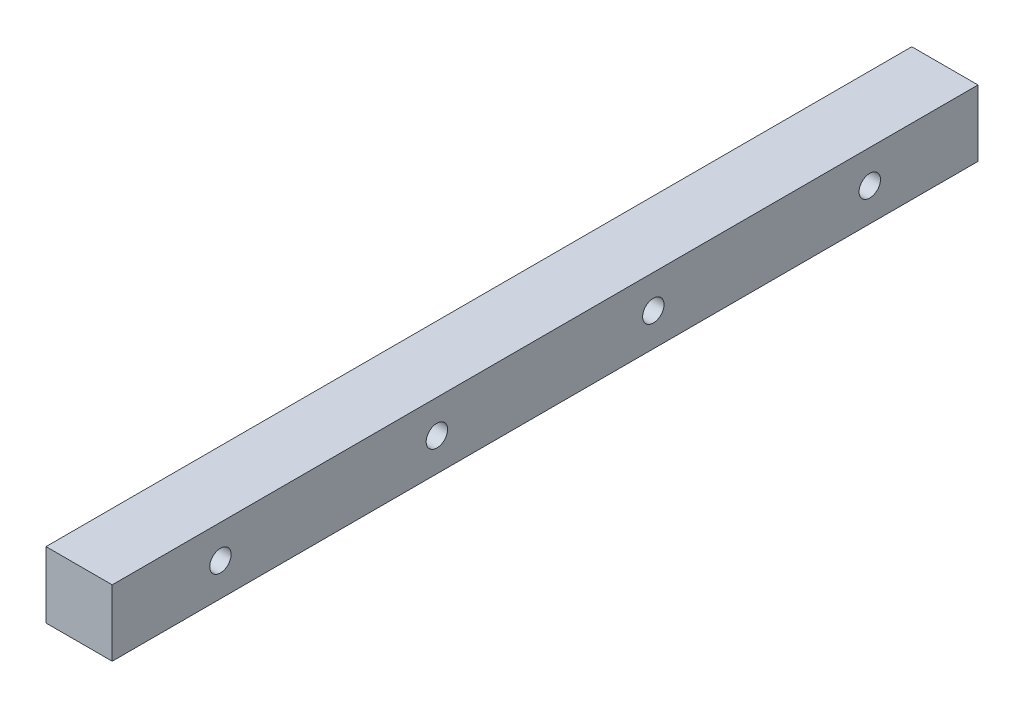
ISO-10303-21;
HEADER;
FILE_DESCRIPTION(('STEP AP214'),'2;1');
FILE_NAME('part.step','',(''),(''),'','','');
FILE_SCHEMA(('AUTOMOTIVE_DESIGN { 1 0 10303 214 1 1 1 1 }'));
ENDSEC;
DATA;
#1=APPLICATION_CONTEXT('core data for automotive mechanical design processes');
#2=APPLICATION_PROTOCOL_DEFINITION('international standard','automotive_design',2000,#1);
#3=PRODUCT_CONTEXT('',#1,'mechanical');
#4=PRODUCT('Part','Part','',(#3));
#5=PRODUCT_RELATED_PRODUCT_CATEGORY('part','',(#4));
#6=PRODUCT_DEFINITION_FORMATION('','',#4);
#7=PRODUCT_DEFINITION_CONTEXT('part definition',#1,'design');
#8=PRODUCT_DEFINITION('design','',#6,#7);
#9=PRODUCT_DEFINITION_SHAPE('','',#8);
#10=(LENGTH_UNIT() NAMED_UNIT(*) SI_UNIT(.MILLI.,.METRE.));
#11=(NAMED_UNIT(*) PLANE_ANGLE_UNIT() SI_UNIT($,.RADIAN.));
#12=(NAMED_UNIT(*) SI_UNIT($,.STERADIAN.) SOLID_ANGLE_UNIT());
#13=UNCERTAINTY_MEASURE_WITH_UNIT(LENGTH_MEASURE(1.E-05),#10,'distance_accuracy_value','');
#14=(GEOMETRIC_REPRESENTATION_CONTEXT(3) GLOBAL_UNCERTAINTY_ASSIGNED_CONTEXT((#13)) GLOBAL_UNIT_ASSIGNED_CONTEXT((#10,
#11,#12)) REPRESENTATION_CONTEXT('',''));
#15=CARTESIAN_POINT('',(0.,0.,0.));
#16=DIRECTION('',(0.,0.,1.));
#17=DIRECTION('',(1.,0.,0.));
#18=AXIS2_PLACEMENT_3D('',#15,#16,#17);
#19=CARTESIAN_POINT('',(-6.5,6.5,85.));
#20=DIRECTION('',(1.,0.,0.));
#21=DIRECTION('',(0.,0.,-1.));
#22=AXIS2_PLACEMENT_3D('',#19,#20,#21);
#23=PLANE('',#22);
#24=CARTESIAN_POINT('',(-6.5,0.,-63.75));
#25=DIRECTION('',(1.,0.,0.));
#26=DIRECTION('',(0.,0.,-1.));
#27=AXIS2_PLACEMENT_3D('',#24,#25,#26);
#28=CIRCLE('',#27,5.25);
#29=CARTESIAN_POINT('',(-6.5,0.,-69.));
#30=VERTEX_POINT('',#29);
#31=EDGE_CURVE('E40',#30,#30,#28,.T.);
#32=ORIENTED_EDGE('',*,*,#31,.T.);
#33=EDGE_LOOP('',(#32));
#34=FACE_BOUND('',#33,.T.);
#35=CARTESIAN_POINT('',(-6.5,0.,-21.25));
#36=DIRECTION('',(1.,0.,0.));
#37=DIRECTION('',(0.,0.,-1.));
#38=AXIS2_PLACEMENT_3D('',#35,#36,#37);
#39=CIRCLE('',#38,5.25);
#40=CARTESIAN_POINT('',(-6.5,0.,-26.5));
#41=VERTEX_POINT('',#40);
#42=EDGE_CURVE('E141',#41,#41,#39,.T.);
#43=ORIENTED_EDGE('',*,*,#42,.T.);
#44=EDGE_LOOP('',(#43));
#45=FACE_BOUND('',#44,.T.);
#46=CARTESIAN_POINT('',(-6.5,0.,21.25));
#47=DIRECTION('',(1.,0.,0.));
#48=DIRECTION('',(0.,0.,-1.));
#49=AXIS2_PLACEMENT_3D('',#46,#47,#48);
#50=CIRCLE('',#49,5.25);
#51=CARTESIAN_POINT('',(-6.5,0.,16.));
#52=VERTEX_POINT('',#51);
#53=EDGE_CURVE('E139',#52,#52,#50,.T.);
#54=ORIENTED_EDGE('',*,*,#53,.T.);
#55=EDGE_LOOP('',(#54));
#56=FACE_BOUND('',#55,.T.);
#57=CARTESIAN_POINT('',(-6.5,0.,63.75));
#58=DIRECTION('',(1.,0.,0.));
#59=DIRECTION('',(0.,0.,-1.));
#60=AXIS2_PLACEMENT_3D('',#57,#58,#59);
#61=CIRCLE('',#60,5.25);
#62=CARTESIAN_POINT('',(-6.5,0.,58.5));
#63=VERTEX_POINT('',#62);
#64=EDGE_CURVE('E136',#63,#63,#61,.T.);
#65=ORIENTED_EDGE('',*,*,#64,.T.);
#66=EDGE_LOOP('',(#65));
#67=FACE_BOUND('',#66,.T.);
#68=DIRECTION('',(0.,-1.,0.));
#69=VECTOR('',#68,1.);
#70=CARTESIAN_POINT('',(-6.5,6.5,-85.));
#71=LINE('',#70,#69);
#72=CARTESIAN_POINT('',(-6.5,6.5,-85.));
#73=VERTEX_POINT('',#72);
#74=CARTESIAN_POINT('',(-6.5,-6.5,-85.));
#75=VERTEX_POINT('',#74);
#76=EDGE_CURVE('E103',#73,#75,#71,.T.);
#77=ORIENTED_EDGE('',*,*,#76,.T.);
#78=DIRECTION('',(0.,0.,-1.));
#79=VECTOR('',#78,1.);
#80=CARTESIAN_POINT('',(-6.5,-6.5,85.));
#81=LINE('',#80,#79);
#82=CARTESIAN_POINT('',(-6.5,-6.5,85.));
#83=VERTEX_POINT('',#82);
#84=EDGE_CURVE('E11',#83,#75,#81,.T.);
#85=ORIENTED_EDGE('',*,*,#84,.F.);
#86=DIRECTION('',(0.,-1.,0.));
#87=VECTOR('',#86,1.);
#88=CARTESIAN_POINT('',(-6.5,6.5,85.));
#89=LINE('',#88,#87);
#90=CARTESIAN_POINT('',(-6.5,6.5,85.));
#91=VERTEX_POINT('',#90);
#92=EDGE_CURVE('E90',#91,#83,#89,.T.);
#93=ORIENTED_EDGE('',*,*,#92,.F.);
#94=DIRECTION('',(0.,0.,-1.));
#95=VECTOR('',#94,1.);
#96=CARTESIAN_POINT('',(-6.5,6.5,85.));
#97=LINE('',#96,#95);
#98=EDGE_CURVE('E99',#91,#73,#97,.T.);
#99=ORIENTED_EDGE('',*,*,#98,.T.);
#100=EDGE_LOOP('',(#77,#85,#93,#99));
#101=FACE_BOUND('',#100,.T.);
#102=ADVANCED_FACE('F37',(#34,#45,#56,#67,#101),#23,.F.);
#103=CARTESIAN_POINT('',(-6.5,-6.5,85.));
#104=DIRECTION('',(0.,1.,0.));
#105=DIRECTION('',(0.,0.,1.));
#106=AXIS2_PLACEMENT_3D('',#103,#104,#105);
#107=PLANE('',#106);
#108=DIRECTION('',(1.,0.,0.));
#109=VECTOR('',#108,1.);
#110=CARTESIAN_POINT('',(-6.5,-6.5,-85.));
#111=LINE('',#110,#109);
#112=CARTESIAN_POINT('',(6.5,-6.5,-85.));
#113=VERTEX_POINT('',#112);
#114=EDGE_CURVE('E94',#75,#113,#111,.T.);
#115=ORIENTED_EDGE('',*,*,#114,.T.);
#116=DIRECTION('',(0.,0.,-1.));
#117=VECTOR('',#116,1.);
#118=CARTESIAN_POINT('',(6.5,-6.5,85.));
#119=LINE('',#118,#117);
#120=CARTESIAN_POINT('',(6.5,-6.5,85.));
#121=VERTEX_POINT('',#120);
#122=EDGE_CURVE('E46',#121,#113,#119,.T.);
#123=ORIENTED_EDGE('',*,*,#122,.F.);
#124=DIRECTION('',(1.,0.,0.));
#125=VECTOR('',#124,1.);
#126=CARTESIAN_POINT('',(-6.5,-6.5,85.));
#127=LINE('',#126,#125);
#128=EDGE_CURVE('E85',#83,#121,#127,.T.);
#129=ORIENTED_EDGE('',*,*,#128,.F.);
#130=ORIENTED_EDGE('',*,*,#84,.T.);
#131=EDGE_LOOP('',(#115,#123,#129,#130));
#132=FACE_BOUND('',#131,.T.);
#133=ADVANCED_FACE('F93',(#132),#107,.F.);
#134=CARTESIAN_POINT('',(6.5,-6.5,85.));
#135=DIRECTION('',(-1.,0.,0.));
#136=DIRECTION('',(0.,0.,1.));
#137=AXIS2_PLACEMENT_3D('',#134,#135,#136);
#138=PLANE('',#137);
#139=CARTESIAN_POINT('',(6.5,0.,-63.75));
#140=DIRECTION('',(-1.,0.,0.));
#141=DIRECTION('',(0.,0.,1.));
#142=AXIS2_PLACEMENT_3D('',#139,#140,#141);
#143=CIRCLE('',#142,2.1);
#144=CARTESIAN_POINT('',(6.5,0.,-61.65));
#145=VERTEX_POINT('',#144);
#146=EDGE_CURVE('E106',#145,#145,#143,.T.);
#147=ORIENTED_EDGE('',*,*,#146,.T.);
#148=EDGE_LOOP('',(#147));
#149=FACE_BOUND('',#148,.T.);
#150=CARTESIAN_POINT('',(6.5,0.,-21.25));
#151=DIRECTION('',(-1.,0.,0.));
#152=DIRECTION('',(0.,0.,1.));
#153=AXIS2_PLACEMENT_3D('',#150,#151,#152);
#154=CIRCLE('',#153,2.1);
#155=CARTESIAN_POINT('',(6.5,0.,-19.15));
#156=VERTEX_POINT('',#155);
#157=EDGE_CURVE('E118',#156,#156,#154,.T.);
#158=ORIENTED_EDGE('',*,*,#157,.T.);
#159=EDGE_LOOP('',(#158));
#160=FACE_BOUND('',#159,.T.);
#161=CARTESIAN_POINT('',(6.5,0.,21.25));
#162=DIRECTION('',(-1.,0.,0.));
#163=DIRECTION('',(0.,0.,1.));
#164=AXIS2_PLACEMENT_3D('',#161,#162,#163);
#165=CIRCLE('',#164,2.1);
#166=CARTESIAN_POINT('',(6.5,0.,23.35));
#167=VERTEX_POINT('',#166);
#168=EDGE_CURVE('E115',#167,#167,#165,.T.);
#169=ORIENTED_EDGE('',*,*,#168,.T.);
#170=EDGE_LOOP('',(#169));
#171=FACE_BOUND('',#170,.T.);
#172=CARTESIAN_POINT('',(6.5,0.,63.75));
#173=DIRECTION('',(-1.,0.,0.));
#174=DIRECTION('',(0.,0.,1.));
#175=AXIS2_PLACEMENT_3D('',#172,#173,#174);
#176=CIRCLE('',#175,2.1);
#177=CARTESIAN_POINT('',(6.5,0.,65.85));
#178=VERTEX_POINT('',#177);
#179=EDGE_CURVE('E112',#178,#178,#176,.T.);
#180=ORIENTED_EDGE('',*,*,#179,.T.);
#181=EDGE_LOOP('',(#180));
#182=FACE_BOUND('',#181,.T.);
#183=DIRECTION('',(0.,1.,0.));
#184=VECTOR('',#183,1.);
#185=CARTESIAN_POINT('',(6.5,-6.5,-85.));
#186=LINE('',#185,#184);
#187=CARTESIAN_POINT('',(6.5,6.5,-85.));
#188=VERTEX_POINT('',#187);
#189=EDGE_CURVE('E72',#113,#188,#186,.T.);
#190=ORIENTED_EDGE('',*,*,#189,.T.);
#191=DIRECTION('',(0.,0.,-1.));
#192=VECTOR('',#191,1.);
#193=CARTESIAN_POINT('',(6.5,6.5,85.));
#194=LINE('',#193,#192);
#195=CARTESIAN_POINT('',(6.5,6.5,85.));
#196=VERTEX_POINT('',#195);
#197=EDGE_CURVE('E95',#196,#188,#194,.T.);
#198=ORIENTED_EDGE('',*,*,#197,.F.);
#199=DIRECTION('',(0.,1.,0.));
#200=VECTOR('',#199,1.);
#201=CARTESIAN_POINT('',(6.5,-6.5,85.));
#202=LINE('',#201,#200);
#203=EDGE_CURVE('E88',#121,#196,#202,.T.);
#204=ORIENTED_EDGE('',*,*,#203,.F.);
#205=ORIENTED_EDGE('',*,*,#122,.T.);
#206=EDGE_LOOP('',(#190,#198,#204,#205));
#207=FACE_BOUND('',#206,.T.);
#208=ADVANCED_FACE('F97',(#149,#160,#171,#182,#207),#138,.F.);
#209=CARTESIAN_POINT('',(6.5,6.5,85.));
#210=DIRECTION('',(0.,-1.,0.));
#211=DIRECTION('',(0.,0.,-1.));
#212=AXIS2_PLACEMENT_3D('',#209,#210,#211);
#213=PLANE('',#212);
#214=DIRECTION('',(-1.,0.,0.));
#215=VECTOR('',#214,1.);
#216=CARTESIAN_POINT('',(6.5,6.5,-85.));
#217=LINE('',#216,#215);
#218=EDGE_CURVE('E78',#188,#73,#217,.T.);
#219=ORIENTED_EDGE('',*,*,#218,.T.);
#220=ORIENTED_EDGE('',*,*,#98,.F.);
#221=DIRECTION('',(-1.,0.,0.));
#222=VECTOR('',#221,1.);
#223=CARTESIAN_POINT('',(6.5,6.5,85.));
#224=LINE('',#223,#222);
#225=EDGE_CURVE('E55',#196,#91,#224,.T.);
#226=ORIENTED_EDGE('',*,*,#225,.F.);
#227=ORIENTED_EDGE('',*,*,#197,.T.);
#228=EDGE_LOOP('',(#219,#220,#226,#227));
#229=FACE_BOUND('',#228,.T.);
#230=ADVANCED_FACE('F174',(#229),#213,.F.);
#231=CARTESIAN_POINT('',(0.,0.,85.));
#232=DIRECTION('',(0.,0.,1.));
#233=DIRECTION('',(1.,0.,0.));
#234=AXIS2_PLACEMENT_3D('',#231,#232,#233);
#235=PLANE('',#234);
#236=ORIENTED_EDGE('',*,*,#92,.T.);
#237=ORIENTED_EDGE('',*,*,#128,.T.);
#238=ORIENTED_EDGE('',*,*,#203,.T.);
#239=ORIENTED_EDGE('',*,*,#225,.T.);
#240=EDGE_LOOP('',(#236,#237,#238,#239));
#241=FACE_BOUND('',#240,.T.);
#242=ADVANCED_FACE('F86',(#241),#235,.T.);
#243=CARTESIAN_POINT('',(0.,0.,-85.));
#244=DIRECTION('',(0.,0.,1.));
#245=DIRECTION('',(1.,0.,0.));
#246=AXIS2_PLACEMENT_3D('',#243,#244,#245);
#247=PLANE('',#246);
#248=ORIENTED_EDGE('',*,*,#76,.F.);
#249=ORIENTED_EDGE('',*,*,#218,.F.);
#250=ORIENTED_EDGE('',*,*,#189,.F.);
#251=ORIENTED_EDGE('',*,*,#114,.F.);
#252=EDGE_LOOP('',(#248,#249,#250,#251));
#253=FACE_BOUND('',#252,.T.);
#254=ADVANCED_FACE('F180',(#253),#247,.F.);
#255=CARTESIAN_POINT('',(-11.5,0.,63.75));
#256=DIRECTION('',(1.,0.,0.));
#257=DIRECTION('',(0.,0.,-1.));
#258=AXIS2_PLACEMENT_3D('',#255,#256,#257);
#259=CYLINDRICAL_SURFACE('',#258,2.1);
#260=CARTESIAN_POINT('',(-2.,0.,63.75));
#261=DIRECTION('',(1.,0.,0.));
#262=DIRECTION('',(0.,0.,-1.));
#263=AXIS2_PLACEMENT_3D('',#260,#261,#262);
#264=CIRCLE('',#263,2.1);
#265=CARTESIAN_POINT('',(-2.,0.,61.65));
#266=VERTEX_POINT('',#265);
#267=EDGE_CURVE('E133',#266,#266,#264,.F.);
#268=ORIENTED_EDGE('',*,*,#267,.T.);
#269=EDGE_LOOP('',(#268));
#270=FACE_BOUND('',#269,.T.);
#271=ORIENTED_EDGE('',*,*,#179,.F.);
#272=EDGE_LOOP('',(#271));
#273=FACE_BOUND('',#272,.T.);
#274=ADVANCED_FACE('F183',(#270,#273),#259,.F.);
#275=CARTESIAN_POINT('',(-11.5,0.,21.25));
#276=DIRECTION('',(1.,0.,0.));
#277=DIRECTION('',(0.,0.,-1.));
#278=AXIS2_PLACEMENT_3D('',#275,#276,#277);
#279=CYLINDRICAL_SURFACE('',#278,2.1);
#280=CARTESIAN_POINT('',(-2.,0.,21.25));
#281=DIRECTION('',(1.,0.,0.));
#282=DIRECTION('',(0.,0.,-1.));
#283=AXIS2_PLACEMENT_3D('',#280,#281,#282);
#284=CIRCLE('',#283,2.1);
#285=CARTESIAN_POINT('',(-2.,0.,19.15));
#286=VERTEX_POINT('',#285);
#287=EDGE_CURVE('E130',#286,#286,#284,.F.);
#288=ORIENTED_EDGE('',*,*,#287,.T.);
#289=EDGE_LOOP('',(#288));
#290=FACE_BOUND('',#289,.T.);
#291=ORIENTED_EDGE('',*,*,#168,.F.);
#292=EDGE_LOOP('',(#291));
#293=FACE_BOUND('',#292,.T.);
#294=ADVANCED_FACE('F189',(#290,#293),#279,.F.);
#295=CARTESIAN_POINT('',(-11.5,0.,-21.25));
#296=DIRECTION('',(1.,0.,0.));
#297=DIRECTION('',(0.,0.,-1.));
#298=AXIS2_PLACEMENT_3D('',#295,#296,#297);
#299=CYLINDRICAL_SURFACE('',#298,2.1);
#300=CARTESIAN_POINT('',(-2.,0.,-21.25));
#301=DIRECTION('',(1.,0.,0.));
#302=DIRECTION('',(0.,0.,-1.));
#303=AXIS2_PLACEMENT_3D('',#300,#301,#302);
#304=CIRCLE('',#303,2.1);
#305=CARTESIAN_POINT('',(-2.,0.,-23.35));
#306=VERTEX_POINT('',#305);
#307=EDGE_CURVE('E126',#306,#306,#304,.F.);
#308=ORIENTED_EDGE('',*,*,#307,.T.);
#309=EDGE_LOOP('',(#308));
#310=FACE_BOUND('',#309,.T.);
#311=ORIENTED_EDGE('',*,*,#157,.F.);
#312=EDGE_LOOP('',(#311));
#313=FACE_BOUND('',#312,.T.);
#314=ADVANCED_FACE('F162',(#310,#313),#299,.F.);
#315=CARTESIAN_POINT('',(-11.5,0.,-63.75));
#316=DIRECTION('',(1.,0.,0.));
#317=DIRECTION('',(0.,0.,-1.));
#318=AXIS2_PLACEMENT_3D('',#315,#316,#317);
#319=CYLINDRICAL_SURFACE('',#318,2.1);
#320=CARTESIAN_POINT('',(-2.,0.,-63.75));
#321=DIRECTION('',(1.,0.,0.));
#322=DIRECTION('',(0.,0.,-1.));
#323=AXIS2_PLACEMENT_3D('',#320,#321,#322);
#324=CIRCLE('',#323,2.1);
#325=CARTESIAN_POINT('',(-2.,0.,-65.85));
#326=VERTEX_POINT('',#325);
#327=EDGE_CURVE('E123',#326,#326,#324,.F.);
#328=ORIENTED_EDGE('',*,*,#327,.T.);
#329=EDGE_LOOP('',(#328));
#330=FACE_BOUND('',#329,.T.);
#331=ORIENTED_EDGE('',*,*,#146,.F.);
#332=EDGE_LOOP('',(#331));
#333=FACE_BOUND('',#332,.T.);
#334=ADVANCED_FACE('F152',(#330,#333),#319,.F.);
#335=CARTESIAN_POINT('',(-11.,0.,-63.75));
#336=DIRECTION('',(1.,0.,0.));
#337=DIRECTION('',(0.,0.,-1.));
#338=AXIS2_PLACEMENT_3D('',#335,#336,#337);
#339=CYLINDRICAL_SURFACE('',#338,5.25);
#340=CARTESIAN_POINT('',(-2.,0.,-63.75));
#341=DIRECTION('',(1.,0.,0.));
#342=DIRECTION('',(0.,0.,-1.));
#343=AXIS2_PLACEMENT_3D('',#340,#341,#342);
#344=CIRCLE('',#343,5.25);
#345=CARTESIAN_POINT('',(-2.,0.,-69.));
#346=VERTEX_POINT('',#345);
#347=EDGE_CURVE('E127',#346,#346,#344,.T.);
#348=ORIENTED_EDGE('',*,*,#347,.T.);
#349=EDGE_LOOP('',(#348));
#350=FACE_BOUND('',#349,.T.);
#351=ORIENTED_EDGE('',*,*,#31,.F.);
#352=EDGE_LOOP('',(#351));
#353=FACE_BOUND('',#352,.T.);
#354=ADVANCED_FACE('F149',(#350,#353),#339,.F.);
#355=CARTESIAN_POINT('',(-2.,0.,-63.75));
#356=DIRECTION('',(1.,0.,0.));
#357=DIRECTION('',(0.,0.,-1.));
#358=AXIS2_PLACEMENT_3D('',#355,#356,#357);
#359=PLANE('',#358);
#360=ORIENTED_EDGE('',*,*,#347,.F.);
#361=EDGE_LOOP('',(#360));
#362=FACE_BOUND('',#361,.T.);
#363=ORIENTED_EDGE('',*,*,#327,.F.);
#364=EDGE_LOOP('',(#363));
#365=FACE_BOUND('',#364,.T.);
#366=ADVANCED_FACE('F151',(#362,#365),#359,.F.);
#367=CARTESIAN_POINT('',(-11.,0.,-21.25));
#368=DIRECTION('',(1.,0.,0.));
#369=DIRECTION('',(0.,0.,-1.));
#370=AXIS2_PLACEMENT_3D('',#367,#368,#369);
#371=CYLINDRICAL_SURFACE('',#370,5.25);
#372=CARTESIAN_POINT('',(-2.,0.,-21.25));
#373=DIRECTION('',(1.,0.,0.));
#374=DIRECTION('',(0.,0.,-1.));
#375=AXIS2_PLACEMENT_3D('',#372,#373,#374);
#376=CIRCLE('',#375,5.25);
#377=CARTESIAN_POINT('',(-2.,0.,-26.5));
#378=VERTEX_POINT('',#377);
#379=EDGE_CURVE('E223',#378,#378,#376,.T.);
#380=ORIENTED_EDGE('',*,*,#379,.T.);
#381=EDGE_LOOP('',(#380));
#382=FACE_BOUND('',#381,.T.);
#383=ORIENTED_EDGE('',*,*,#42,.F.);
#384=EDGE_LOOP('',(#383));
#385=FACE_BOUND('',#384,.T.);
#386=ADVANCED_FACE('F159',(#382,#385),#371,.F.);
#387=CARTESIAN_POINT('',(-2.,0.,-21.25));
#388=DIRECTION('',(1.,0.,0.));
#389=DIRECTION('',(0.,0.,-1.));
#390=AXIS2_PLACEMENT_3D('',#387,#388,#389);
#391=PLANE('',#390);
#392=ORIENTED_EDGE('',*,*,#379,.F.);
#393=EDGE_LOOP('',(#392));
#394=FACE_BOUND('',#393,.T.);
#395=ORIENTED_EDGE('',*,*,#307,.F.);
#396=EDGE_LOOP('',(#395));
#397=FACE_BOUND('',#396,.T.);
#398=ADVANCED_FACE('F212',(#394,#397),#391,.F.);
#399=CARTESIAN_POINT('',(-11.,0.,21.25));
#400=DIRECTION('',(1.,0.,0.));
#401=DIRECTION('',(0.,0.,-1.));
#402=AXIS2_PLACEMENT_3D('',#399,#400,#401);
#403=CYLINDRICAL_SURFACE('',#402,5.25);
#404=CARTESIAN_POINT('',(-2.,0.,21.25));
#405=DIRECTION('',(1.,0.,0.));
#406=DIRECTION('',(0.,0.,-1.));
#407=AXIS2_PLACEMENT_3D('',#404,#405,#406);
#408=CIRCLE('',#407,5.25);
#409=CARTESIAN_POINT('',(-2.,0.,16.));
#410=VERTEX_POINT('',#409);
#411=EDGE_CURVE('E224',#410,#410,#408,.T.);
#412=ORIENTED_EDGE('',*,*,#411,.T.);
#413=EDGE_LOOP('',(#412));
#414=FACE_BOUND('',#413,.T.);
#415=ORIENTED_EDGE('',*,*,#53,.F.);
#416=EDGE_LOOP('',(#415));
#417=FACE_BOUND('',#416,.T.);
#418=ADVANCED_FACE('F208',(#414,#417),#403,.F.);
#419=CARTESIAN_POINT('',(-2.,0.,21.25));
#420=DIRECTION('',(1.,0.,0.));
#421=DIRECTION('',(0.,0.,-1.));
#422=AXIS2_PLACEMENT_3D('',#419,#420,#421);
#423=PLANE('',#422);
#424=ORIENTED_EDGE('',*,*,#411,.F.);
#425=EDGE_LOOP('',(#424));
#426=FACE_BOUND('',#425,.T.);
#427=ORIENTED_EDGE('',*,*,#287,.F.);
#428=EDGE_LOOP('',(#427));
#429=FACE_BOUND('',#428,.T.);
#430=ADVANCED_FACE('F204',(#426,#429),#423,.F.);
#431=CARTESIAN_POINT('',(-11.,0.,63.75));
#432=DIRECTION('',(1.,0.,0.));
#433=DIRECTION('',(0.,0.,-1.));
#434=AXIS2_PLACEMENT_3D('',#431,#432,#433);
#435=CYLINDRICAL_SURFACE('',#434,5.25);
#436=CARTESIAN_POINT('',(-2.,0.,63.75));
#437=DIRECTION('',(1.,0.,0.));
#438=DIRECTION('',(0.,0.,-1.));
#439=AXIS2_PLACEMENT_3D('',#436,#437,#438);
#440=CIRCLE('',#439,5.25);
#441=CARTESIAN_POINT('',(-2.,0.,58.5));
#442=VERTEX_POINT('',#441);
#443=EDGE_CURVE('E228',#442,#442,#440,.T.);
#444=ORIENTED_EDGE('',*,*,#443,.T.);
#445=EDGE_LOOP('',(#444));
#446=FACE_BOUND('',#445,.T.);
#447=ORIENTED_EDGE('',*,*,#64,.F.);
#448=EDGE_LOOP('',(#447));
#449=FACE_BOUND('',#448,.T.);
#450=ADVANCED_FACE('F200',(#446,#449),#435,.F.);
#451=CARTESIAN_POINT('',(-2.,0.,63.75));
#452=DIRECTION('',(1.,0.,0.));
#453=DIRECTION('',(0.,0.,-1.));
#454=AXIS2_PLACEMENT_3D('',#451,#452,#453);
#455=PLANE('',#454);
#456=ORIENTED_EDGE('',*,*,#443,.F.);
#457=EDGE_LOOP('',(#456));
#458=FACE_BOUND('',#457,.T.);
#459=ORIENTED_EDGE('',*,*,#267,.F.);
#460=EDGE_LOOP('',(#459));
#461=FACE_BOUND('',#460,.T.);
#462=ADVANCED_FACE('F197',(#458,#461),#455,.F.);
#463=CLOSED_SHELL('',(#102,#133,#208,#230,#242,#254,#274,#294,#314,#334,#354,#366,#386,#398,
#418,#430,#450,#462));
#464=MANIFOLD_SOLID_BREP('B2',#463);
#465=ADVANCED_BREP_SHAPE_REPRESENTATION('',(#18,#464),#14);
#466=SHAPE_DEFINITION_REPRESENTATION(#9,#465);
ENDSEC;
END-ISO-10303-21;
